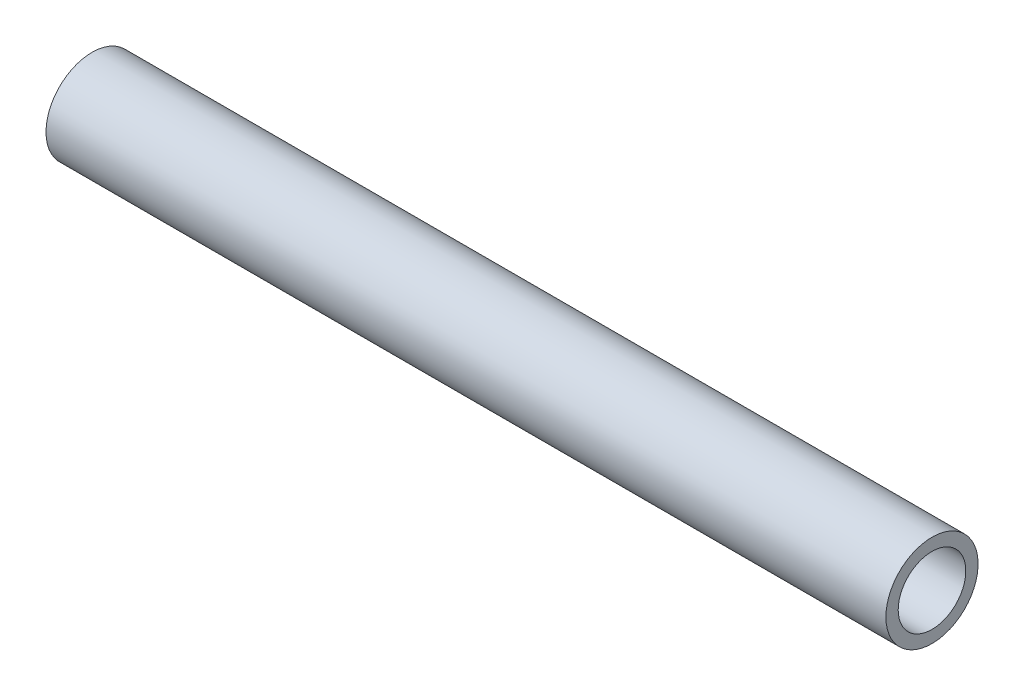
ISO-10303-21;
HEADER;
FILE_DESCRIPTION(('STEP AP214'),'2;1');
FILE_NAME('part.step','',(''),(''),'','','');
FILE_SCHEMA(('AUTOMOTIVE_DESIGN { 1 0 10303 214 1 1 1 1 }'));
ENDSEC;
DATA;
#1=APPLICATION_CONTEXT('core data for automotive mechanical design processes');
#2=APPLICATION_PROTOCOL_DEFINITION('international standard','automotive_design',2000,#1);
#3=PRODUCT_CONTEXT('',#1,'mechanical');
#4=PRODUCT('Part','Part','',(#3));
#5=PRODUCT_RELATED_PRODUCT_CATEGORY('part','',(#4));
#6=PRODUCT_DEFINITION_FORMATION('','',#4);
#7=PRODUCT_DEFINITION_CONTEXT('part definition',#1,'design');
#8=PRODUCT_DEFINITION('design','',#6,#7);
#9=PRODUCT_DEFINITION_SHAPE('','',#8);
#10=(LENGTH_UNIT() NAMED_UNIT(*) SI_UNIT(.MILLI.,.METRE.));
#11=(NAMED_UNIT(*) PLANE_ANGLE_UNIT() SI_UNIT($,.RADIAN.));
#12=(NAMED_UNIT(*) SI_UNIT($,.STERADIAN.) SOLID_ANGLE_UNIT());
#13=UNCERTAINTY_MEASURE_WITH_UNIT(LENGTH_MEASURE(1.E-05),#10,'distance_accuracy_value','');
#14=(GEOMETRIC_REPRESENTATION_CONTEXT(3) GLOBAL_UNCERTAINTY_ASSIGNED_CONTEXT((#13)) GLOBAL_UNIT_ASSIGNED_CONTEXT((#10,
#11,#12)) REPRESENTATION_CONTEXT('',''));
#15=CARTESIAN_POINT('',(0.,0.,0.));
#16=DIRECTION('',(0.,0.,1.));
#17=DIRECTION('',(1.,0.,0.));
#18=AXIS2_PLACEMENT_3D('',#15,#16,#17);
#19=CARTESIAN_POINT('',(118.7,2.25,0.));
#20=DIRECTION('',(1.,0.,0.));
#21=DIRECTION('',(0.,0.,-1.));
#22=AXIS2_PLACEMENT_3D('',#19,#20,#21);
#23=PLANE('',#22);
#24=CARTESIAN_POINT('',(118.7,0.,0.));
#25=DIRECTION('',(-1.,0.,0.));
#26=DIRECTION('',(0.,0.,1.));
#27=AXIS2_PLACEMENT_3D('',#24,#25,#26);
#28=CIRCLE('',#27,1.65);
#29=CARTESIAN_POINT('',(118.7,0.,1.65));
#30=VERTEX_POINT('',#29);
#31=EDGE_CURVE('E10',#30,#30,#28,.T.);
#32=ORIENTED_EDGE('',*,*,#31,.F.);
#33=EDGE_LOOP('',(#32));
#34=FACE_BOUND('',#33,.T.);
#35=CARTESIAN_POINT('',(118.7,0.,0.));
#36=DIRECTION('',(-1.,0.,0.));
#37=DIRECTION('',(0.,0.,1.));
#38=AXIS2_PLACEMENT_3D('',#35,#36,#37);
#39=CIRCLE('',#38,2.25);
#40=CARTESIAN_POINT('',(118.7,0.,2.25));
#41=VERTEX_POINT('',#40);
#42=EDGE_CURVE('E45',#41,#41,#39,.T.);
#43=ORIENTED_EDGE('',*,*,#42,.T.);
#44=EDGE_LOOP('',(#43));
#45=FACE_BOUND('',#44,.T.);
#46=ADVANCED_FACE('F31',(#34,#45),#23,.F.);
#47=CARTESIAN_POINT('',(-110.,0.,0.));
#48=DIRECTION('',(-1.,0.,0.));
#49=DIRECTION('',(0.,0.,1.));
#50=AXIS2_PLACEMENT_3D('',#47,#48,#49);
#51=CYLINDRICAL_SURFACE('',#50,1.65);
#52=CARTESIAN_POINT('',(159.7,0.,0.));
#53=DIRECTION('',(-1.,0.,0.));
#54=DIRECTION('',(0.,0.,1.));
#55=AXIS2_PLACEMENT_3D('',#52,#53,#54);
#56=CIRCLE('',#55,1.65);
#57=CARTESIAN_POINT('',(159.7,0.,1.65));
#58=VERTEX_POINT('',#57);
#59=EDGE_CURVE('E37',#58,#58,#56,.T.);
#60=ORIENTED_EDGE('',*,*,#59,.F.);
#61=EDGE_LOOP('',(#60));
#62=FACE_BOUND('',#61,.T.);
#63=ORIENTED_EDGE('',*,*,#31,.T.);
#64=EDGE_LOOP('',(#63));
#65=FACE_BOUND('',#64,.T.);
#66=ADVANCED_FACE('F60',(#62,#65),#51,.F.);
#67=CARTESIAN_POINT('',(159.7,1.65,0.));
#68=DIRECTION('',(-1.,0.,0.));
#69=DIRECTION('',(0.,0.,1.));
#70=AXIS2_PLACEMENT_3D('',#67,#68,#69);
#71=PLANE('',#70);
#72=CARTESIAN_POINT('',(159.7,0.,0.));
#73=DIRECTION('',(-1.,0.,0.));
#74=DIRECTION('',(0.,0.,1.));
#75=AXIS2_PLACEMENT_3D('',#72,#73,#74);
#76=CIRCLE('',#75,2.25);
#77=CARTESIAN_POINT('',(159.7,0.,2.25));
#78=VERTEX_POINT('',#77);
#79=EDGE_CURVE('E41',#78,#78,#76,.T.);
#80=ORIENTED_EDGE('',*,*,#79,.F.);
#81=EDGE_LOOP('',(#80));
#82=FACE_BOUND('',#81,.T.);
#83=ORIENTED_EDGE('',*,*,#59,.T.);
#84=EDGE_LOOP('',(#83));
#85=FACE_BOUND('',#84,.T.);
#86=ADVANCED_FACE('F55',(#82,#85),#71,.F.);
#87=CARTESIAN_POINT('',(-110.,0.,0.));
#88=DIRECTION('',(-1.,0.,0.));
#89=DIRECTION('',(0.,0.,1.));
#90=AXIS2_PLACEMENT_3D('',#87,#88,#89);
#91=CYLINDRICAL_SURFACE('',#90,2.25);
#92=ORIENTED_EDGE('',*,*,#42,.F.);
#93=EDGE_LOOP('',(#92));
#94=FACE_BOUND('',#93,.T.);
#95=ORIENTED_EDGE('',*,*,#79,.T.);
#96=EDGE_LOOP('',(#95));
#97=FACE_BOUND('',#96,.T.);
#98=ADVANCED_FACE('F52',(#94,#97),#91,.T.);
#99=CLOSED_SHELL('',(#46,#66,#86,#98));
#100=MANIFOLD_SOLID_BREP('B2',#99);
#101=ADVANCED_BREP_SHAPE_REPRESENTATION('',(#18,#100),#14);
#102=SHAPE_DEFINITION_REPRESENTATION(#9,#101);
ENDSEC;
END-ISO-10303-21;
